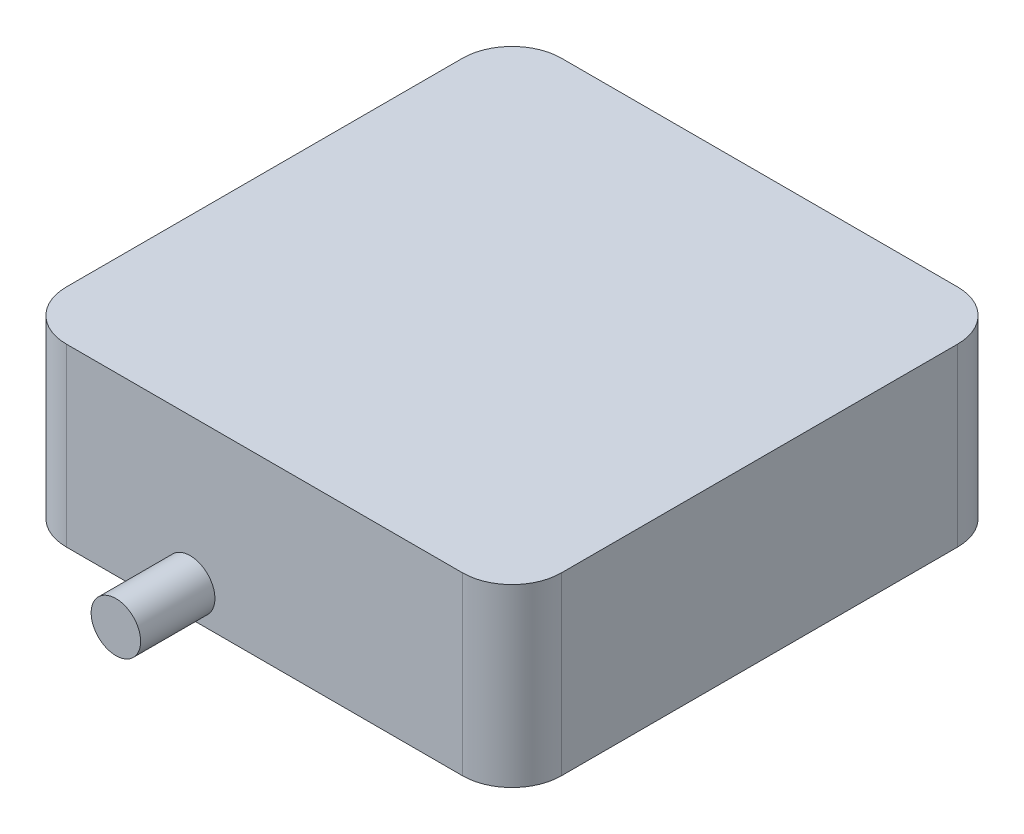
ISO-10303-21;
HEADER;
FILE_DESCRIPTION(('STEP AP214'),'2;1');
FILE_NAME('part.step','',(''),(''),'','','');
FILE_SCHEMA(('AUTOMOTIVE_DESIGN { 1 0 10303 214 1 1 1 1 }'));
ENDSEC;
DATA;
#1=APPLICATION_CONTEXT('core data for automotive mechanical design processes');
#2=APPLICATION_PROTOCOL_DEFINITION('international standard','automotive_design',2000,#1);
#3=PRODUCT_CONTEXT('',#1,'mechanical');
#4=PRODUCT('Part','Part','',(#3));
#5=PRODUCT_RELATED_PRODUCT_CATEGORY('part','',(#4));
#6=PRODUCT_DEFINITION_FORMATION('','',#4);
#7=PRODUCT_DEFINITION_CONTEXT('part definition',#1,'design');
#8=PRODUCT_DEFINITION('design','',#6,#7);
#9=PRODUCT_DEFINITION_SHAPE('','',#8);
#10=(LENGTH_UNIT() NAMED_UNIT(*) SI_UNIT(.MILLI.,.METRE.));
#11=(NAMED_UNIT(*) PLANE_ANGLE_UNIT() SI_UNIT($,.RADIAN.));
#12=(NAMED_UNIT(*) SI_UNIT($,.STERADIAN.) SOLID_ANGLE_UNIT());
#13=UNCERTAINTY_MEASURE_WITH_UNIT(LENGTH_MEASURE(1.E-05),#10,'distance_accuracy_value','');
#14=(GEOMETRIC_REPRESENTATION_CONTEXT(3) GLOBAL_UNCERTAINTY_ASSIGNED_CONTEXT((#13)) GLOBAL_UNIT_ASSIGNED_CONTEXT((#10,
#11,#12)) REPRESENTATION_CONTEXT('',''));
#15=CARTESIAN_POINT('',(0.,0.,0.));
#16=DIRECTION('',(0.,0.,1.));
#17=DIRECTION('',(1.,0.,0.));
#18=AXIS2_PLACEMENT_3D('',#15,#16,#17);
#19=CARTESIAN_POINT('',(100.,71.,100.));
#20=DIRECTION('',(-1.,0.,0.));
#21=DIRECTION('',(0.,0.,1.));
#22=AXIS2_PLACEMENT_3D('',#19,#20,#21);
#23=PLANE('',#22);
#24=DIRECTION('',(0.,0.,-1.));
#25=VECTOR('',#24,1.);
#26=CARTESIAN_POINT('',(100.,0.,100.));
#27=LINE('',#26,#25);
#28=CARTESIAN_POINT('',(100.,0.,80.));
#29=VERTEX_POINT('',#28);
#30=CARTESIAN_POINT('',(100.,0.,-80.));
#31=VERTEX_POINT('',#30);
#32=EDGE_CURVE('E141',#29,#31,#27,.T.);
#33=ORIENTED_EDGE('',*,*,#32,.T.);
#34=DIRECTION('',(0.,-1.,0.));
#35=VECTOR('',#34,1.);
#36=CARTESIAN_POINT('',(100.,71.,-80.));
#37=LINE('',#36,#35);
#38=CARTESIAN_POINT('',(100.,71.,-80.));
#39=VERTEX_POINT('',#38);
#40=EDGE_CURVE('E164',#31,#39,#37,.F.);
#41=ORIENTED_EDGE('',*,*,#40,.T.);
#42=DIRECTION('',(0.,0.,-1.));
#43=VECTOR('',#42,1.);
#44=CARTESIAN_POINT('',(100.,71.,100.));
#45=LINE('',#44,#43);
#46=CARTESIAN_POINT('',(100.,71.,80.));
#47=VERTEX_POINT('',#46);
#48=EDGE_CURVE('E139',#47,#39,#45,.T.);
#49=ORIENTED_EDGE('',*,*,#48,.F.);
#50=DIRECTION('',(0.,-1.,0.));
#51=VECTOR('',#50,1.);
#52=CARTESIAN_POINT('',(100.,71.,80.));
#53=LINE('',#52,#51);
#54=EDGE_CURVE('E161',#47,#29,#53,.T.);
#55=ORIENTED_EDGE('',*,*,#54,.T.);
#56=EDGE_LOOP('',(#33,#41,#49,#55));
#57=FACE_BOUND('',#56,.T.);
#58=ADVANCED_FACE('F45',(#57),#23,.F.);
#59=CARTESIAN_POINT('',(-100.,71.,-100.));
#60=DIRECTION('',(0.,0.,1.));
#61=DIRECTION('',(1.,0.,0.));
#62=AXIS2_PLACEMENT_3D('',#59,#60,#61);
#63=PLANE('',#62);
#64=DIRECTION('',(-1.,0.,0.));
#65=VECTOR('',#64,1.);
#66=CARTESIAN_POINT('',(-100.,0.,-100.));
#67=LINE('',#66,#65);
#68=CARTESIAN_POINT('',(80.,0.,-100.));
#69=VERTEX_POINT('',#68);
#70=CARTESIAN_POINT('',(-80.,0.,-100.));
#71=VERTEX_POINT('',#70);
#72=EDGE_CURVE('E137',#69,#71,#67,.T.);
#73=ORIENTED_EDGE('',*,*,#72,.T.);
#74=DIRECTION('',(0.,-1.,0.));
#75=VECTOR('',#74,1.);
#76=CARTESIAN_POINT('',(-80.,71.,-100.));
#77=LINE('',#76,#75);
#78=CARTESIAN_POINT('',(-80.,71.,-100.));
#79=VERTEX_POINT('',#78);
#80=EDGE_CURVE('E116',#71,#79,#77,.F.);
#81=ORIENTED_EDGE('',*,*,#80,.T.);
#82=DIRECTION('',(-1.,0.,0.));
#83=VECTOR('',#82,1.);
#84=CARTESIAN_POINT('',(-100.,71.,-100.));
#85=LINE('',#84,#83);
#86=CARTESIAN_POINT('',(80.,71.,-100.));
#87=VERTEX_POINT('',#86);
#88=EDGE_CURVE('E182',#87,#79,#85,.T.);
#89=ORIENTED_EDGE('',*,*,#88,.F.);
#90=DIRECTION('',(0.,-1.,0.));
#91=VECTOR('',#90,1.);
#92=CARTESIAN_POINT('',(80.,71.,-100.));
#93=LINE('',#92,#91);
#94=EDGE_CURVE('E121',#87,#69,#93,.T.);
#95=ORIENTED_EDGE('',*,*,#94,.T.);
#96=EDGE_LOOP('',(#73,#81,#89,#95));
#97=FACE_BOUND('',#96,.T.);
#98=ADVANCED_FACE('F210',(#97),#63,.F.);
#99=CARTESIAN_POINT('',(-100.,71.,100.));
#100=DIRECTION('',(1.,0.,0.));
#101=DIRECTION('',(0.,0.,-1.));
#102=AXIS2_PLACEMENT_3D('',#99,#100,#101);
#103=PLANE('',#102);
#104=DIRECTION('',(0.,0.,1.));
#105=VECTOR('',#104,1.);
#106=CARTESIAN_POINT('',(-100.,71.,100.));
#107=LINE('',#106,#105);
#108=CARTESIAN_POINT('',(-100.,71.,-80.));
#109=VERTEX_POINT('',#108);
#110=CARTESIAN_POINT('',(-100.,71.,80.));
#111=VERTEX_POINT('',#110);
#112=EDGE_CURVE('E130',#109,#111,#107,.T.);
#113=ORIENTED_EDGE('',*,*,#112,.F.);
#114=DIRECTION('',(0.,-1.,0.));
#115=VECTOR('',#114,1.);
#116=CARTESIAN_POINT('',(-100.,71.,-80.));
#117=LINE('',#116,#115);
#118=CARTESIAN_POINT('',(-100.,0.,-80.));
#119=VERTEX_POINT('',#118);
#120=EDGE_CURVE('E115',#109,#119,#117,.T.);
#121=ORIENTED_EDGE('',*,*,#120,.T.);
#122=DIRECTION('',(0.,0.,1.));
#123=VECTOR('',#122,1.);
#124=CARTESIAN_POINT('',(-100.,0.,100.));
#125=LINE('',#124,#123);
#126=CARTESIAN_POINT('',(-100.,0.,80.));
#127=VERTEX_POINT('',#126);
#128=EDGE_CURVE('E128',#119,#127,#125,.T.);
#129=ORIENTED_EDGE('',*,*,#128,.T.);
#130=DIRECTION('',(0.,-1.,0.));
#131=VECTOR('',#130,1.);
#132=CARTESIAN_POINT('',(-100.,71.,80.));
#133=LINE('',#132,#131);
#134=EDGE_CURVE('E132',#127,#111,#133,.F.);
#135=ORIENTED_EDGE('',*,*,#134,.T.);
#136=EDGE_LOOP('',(#113,#121,#129,#135));
#137=FACE_BOUND('',#136,.T.);
#138=ADVANCED_FACE('F127',(#137),#103,.F.);
#139=CARTESIAN_POINT('',(-100.,71.,100.));
#140=DIRECTION('',(0.,0.,-1.));
#141=DIRECTION('',(-1.,0.,0.));
#142=AXIS2_PLACEMENT_3D('',#139,#140,#141);
#143=PLANE('',#142);
#144=CARTESIAN_POINT('',(-30.,12.,100.));
#145=DIRECTION('',(0.,0.,-1.));
#146=DIRECTION('',(-1.,0.,0.));
#147=AXIS2_PLACEMENT_3D('',#144,#145,#146);
#148=CIRCLE('',#147,10.);
#149=CARTESIAN_POINT('',(-40.,12.,100.));
#150=VERTEX_POINT('',#149);
#151=EDGE_CURVE('E11',#150,#150,#148,.F.);
#152=ORIENTED_EDGE('',*,*,#151,.F.);
#153=EDGE_LOOP('',(#152));
#154=FACE_BOUND('',#153,.T.);
#155=DIRECTION('',(1.,0.,0.));
#156=VECTOR('',#155,1.);
#157=CARTESIAN_POINT('',(-100.,0.,100.));
#158=LINE('',#157,#156);
#159=CARTESIAN_POINT('',(-80.,0.,100.));
#160=VERTEX_POINT('',#159);
#161=CARTESIAN_POINT('',(80.,0.,100.));
#162=VERTEX_POINT('',#161);
#163=EDGE_CURVE('E136',#160,#162,#158,.T.);
#164=ORIENTED_EDGE('',*,*,#163,.T.);
#165=DIRECTION('',(0.,-1.,0.));
#166=VECTOR('',#165,1.);
#167=CARTESIAN_POINT('',(80.,71.,100.));
#168=LINE('',#167,#166);
#169=CARTESIAN_POINT('',(80.,71.,100.));
#170=VERTEX_POINT('',#169);
#171=EDGE_CURVE('E53',#162,#170,#168,.F.);
#172=ORIENTED_EDGE('',*,*,#171,.T.);
#173=DIRECTION('',(1.,0.,0.));
#174=VECTOR('',#173,1.);
#175=CARTESIAN_POINT('',(-100.,71.,100.));
#176=LINE('',#175,#174);
#177=CARTESIAN_POINT('',(-80.,71.,100.));
#178=VERTEX_POINT('',#177);
#179=EDGE_CURVE('E145',#178,#170,#176,.T.);
#180=ORIENTED_EDGE('',*,*,#179,.F.);
#181=DIRECTION('',(0.,-1.,0.));
#182=VECTOR('',#181,1.);
#183=CARTESIAN_POINT('',(-80.,71.,100.));
#184=LINE('',#183,#182);
#185=EDGE_CURVE('E166',#178,#160,#184,.T.);
#186=ORIENTED_EDGE('',*,*,#185,.T.);
#187=EDGE_LOOP('',(#164,#172,#180,#186));
#188=FACE_BOUND('',#187,.T.);
#189=ADVANCED_FACE('F169',(#154,#188),#143,.F.);
#190=CARTESIAN_POINT('',(0.,71.,0.));
#191=DIRECTION('',(0.,-1.,0.));
#192=DIRECTION('',(0.,0.,-1.));
#193=AXIS2_PLACEMENT_3D('',#190,#191,#192);
#194=PLANE('',#193);
#195=ORIENTED_EDGE('',*,*,#88,.T.);
#196=CARTESIAN_POINT('',(-80.,71.,-80.));
#197=DIRECTION('',(0.,-1.,0.));
#198=DIRECTION('',(0.,0.,-1.));
#199=AXIS2_PLACEMENT_3D('',#196,#197,#198);
#200=CIRCLE('',#199,20.);
#201=EDGE_CURVE('E159',#79,#109,#200,.F.);
#202=ORIENTED_EDGE('',*,*,#201,.T.);
#203=ORIENTED_EDGE('',*,*,#112,.T.);
#204=CARTESIAN_POINT('',(-80.,71.,80.));
#205=DIRECTION('',(0.,-1.,0.));
#206=DIRECTION('',(0.,0.,-1.));
#207=AXIS2_PLACEMENT_3D('',#204,#205,#206);
#208=CIRCLE('',#207,20.);
#209=EDGE_CURVE('E66',#111,#178,#208,.F.);
#210=ORIENTED_EDGE('',*,*,#209,.T.);
#211=ORIENTED_EDGE('',*,*,#179,.T.);
#212=CARTESIAN_POINT('',(80.,71.,80.));
#213=DIRECTION('',(0.,-1.,0.));
#214=DIRECTION('',(0.,0.,-1.));
#215=AXIS2_PLACEMENT_3D('',#212,#213,#214);
#216=CIRCLE('',#215,20.);
#217=EDGE_CURVE('E155',#170,#47,#216,.F.);
#218=ORIENTED_EDGE('',*,*,#217,.T.);
#219=ORIENTED_EDGE('',*,*,#48,.T.);
#220=CARTESIAN_POINT('',(80.,71.,-80.));
#221=DIRECTION('',(0.,-1.,0.));
#222=DIRECTION('',(0.,0.,-1.));
#223=AXIS2_PLACEMENT_3D('',#220,#221,#222);
#224=CIRCLE('',#223,20.);
#225=EDGE_CURVE('E157',#39,#87,#224,.F.);
#226=ORIENTED_EDGE('',*,*,#225,.T.);
#227=EDGE_LOOP('',(#195,#202,#203,#210,#211,#218,#219,#226));
#228=FACE_BOUND('',#227,.T.);
#229=ADVANCED_FACE('F202',(#228),#194,.F.);
#230=CARTESIAN_POINT('',(0.,0.,0.));
#231=DIRECTION('',(0.,-1.,0.));
#232=DIRECTION('',(0.,0.,-1.));
#233=AXIS2_PLACEMENT_3D('',#230,#231,#232);
#234=PLANE('',#233);
#235=ORIENTED_EDGE('',*,*,#128,.F.);
#236=CARTESIAN_POINT('',(-80.,0.,-80.));
#237=DIRECTION('',(0.,-1.,0.));
#238=DIRECTION('',(0.,0.,-1.));
#239=AXIS2_PLACEMENT_3D('',#236,#237,#238);
#240=CIRCLE('',#239,20.);
#241=EDGE_CURVE('E111',#119,#71,#240,.T.);
#242=ORIENTED_EDGE('',*,*,#241,.T.);
#243=ORIENTED_EDGE('',*,*,#72,.F.);
#244=CARTESIAN_POINT('',(80.,0.,-80.));
#245=DIRECTION('',(0.,-1.,0.));
#246=DIRECTION('',(0.,0.,-1.));
#247=AXIS2_PLACEMENT_3D('',#244,#245,#246);
#248=CIRCLE('',#247,20.);
#249=EDGE_CURVE('E122',#69,#31,#248,.T.);
#250=ORIENTED_EDGE('',*,*,#249,.T.);
#251=ORIENTED_EDGE('',*,*,#32,.F.);
#252=CARTESIAN_POINT('',(80.,0.,80.));
#253=DIRECTION('',(0.,-1.,0.));
#254=DIRECTION('',(0.,0.,-1.));
#255=AXIS2_PLACEMENT_3D('',#252,#253,#254);
#256=CIRCLE('',#255,20.);
#257=EDGE_CURVE('E148',#29,#162,#256,.T.);
#258=ORIENTED_EDGE('',*,*,#257,.T.);
#259=ORIENTED_EDGE('',*,*,#163,.F.);
#260=CARTESIAN_POINT('',(-80.,0.,80.));
#261=DIRECTION('',(0.,-1.,0.));
#262=DIRECTION('',(0.,0.,-1.));
#263=AXIS2_PLACEMENT_3D('',#260,#261,#262);
#264=CIRCLE('',#263,20.);
#265=EDGE_CURVE('E131',#160,#127,#264,.T.);
#266=ORIENTED_EDGE('',*,*,#265,.T.);
#267=EDGE_LOOP('',(#235,#242,#243,#250,#251,#258,#259,#266));
#268=FACE_BOUND('',#267,.T.);
#269=ADVANCED_FACE('F134',(#268),#234,.T.);
#270=CARTESIAN_POINT('',(-80.,71.,-80.));
#271=DIRECTION('',(0.,-1.,0.));
#272=DIRECTION('',(0.,0.,-1.));
#273=AXIS2_PLACEMENT_3D('',#270,#271,#272);
#274=CYLINDRICAL_SURFACE('',#273,20.);
#275=ORIENTED_EDGE('',*,*,#201,.F.);
#276=ORIENTED_EDGE('',*,*,#80,.F.);
#277=ORIENTED_EDGE('',*,*,#241,.F.);
#278=ORIENTED_EDGE('',*,*,#120,.F.);
#279=EDGE_LOOP('',(#275,#276,#277,#278));
#280=FACE_BOUND('',#279,.T.);
#281=ADVANCED_FACE('F114',(#280),#274,.T.);
#282=CARTESIAN_POINT('',(80.,71.,-80.));
#283=DIRECTION('',(0.,-1.,0.));
#284=DIRECTION('',(0.,0.,-1.));
#285=AXIS2_PLACEMENT_3D('',#282,#283,#284);
#286=CYLINDRICAL_SURFACE('',#285,20.);
#287=ORIENTED_EDGE('',*,*,#225,.F.);
#288=ORIENTED_EDGE('',*,*,#40,.F.);
#289=ORIENTED_EDGE('',*,*,#249,.F.);
#290=ORIENTED_EDGE('',*,*,#94,.F.);
#291=EDGE_LOOP('',(#287,#288,#289,#290));
#292=FACE_BOUND('',#291,.T.);
#293=ADVANCED_FACE('F223',(#292),#286,.T.);
#294=CARTESIAN_POINT('',(80.,71.,80.));
#295=DIRECTION('',(0.,-1.,0.));
#296=DIRECTION('',(0.,0.,-1.));
#297=AXIS2_PLACEMENT_3D('',#294,#295,#296);
#298=CYLINDRICAL_SURFACE('',#297,20.);
#299=ORIENTED_EDGE('',*,*,#217,.F.);
#300=ORIENTED_EDGE('',*,*,#171,.F.);
#301=ORIENTED_EDGE('',*,*,#257,.F.);
#302=ORIENTED_EDGE('',*,*,#54,.F.);
#303=EDGE_LOOP('',(#299,#300,#301,#302));
#304=FACE_BOUND('',#303,.T.);
#305=ADVANCED_FACE('F176',(#304),#298,.T.);
#306=CARTESIAN_POINT('',(-80.,71.,80.));
#307=DIRECTION('',(0.,-1.,0.));
#308=DIRECTION('',(0.,0.,-1.));
#309=AXIS2_PLACEMENT_3D('',#306,#307,#308);
#310=CYLINDRICAL_SURFACE('',#309,20.);
#311=ORIENTED_EDGE('',*,*,#209,.F.);
#312=ORIENTED_EDGE('',*,*,#134,.F.);
#313=ORIENTED_EDGE('',*,*,#265,.F.);
#314=ORIENTED_EDGE('',*,*,#185,.F.);
#315=EDGE_LOOP('',(#311,#312,#313,#314));
#316=FACE_BOUND('',#315,.T.);
#317=ADVANCED_FACE('F47',(#316),#310,.T.);
#318=CARTESIAN_POINT('',(-30.,12.,130.));
#319=DIRECTION('',(0.,0.,-1.));
#320=DIRECTION('',(-1.,0.,0.));
#321=AXIS2_PLACEMENT_3D('',#318,#319,#320);
#322=CYLINDRICAL_SURFACE('',#321,10.);
#323=CARTESIAN_POINT('',(-30.,12.,130.));
#324=DIRECTION('',(0.,0.,1.));
#325=DIRECTION('',(1.,0.,0.));
#326=AXIS2_PLACEMENT_3D('',#323,#324,#325);
#327=CIRCLE('',#326,10.);
#328=CARTESIAN_POINT('',(-20.,12.,130.));
#329=VERTEX_POINT('',#328);
#330=EDGE_CURVE('E187',#329,#329,#327,.T.);
#331=ORIENTED_EDGE('',*,*,#330,.F.);
#332=EDGE_LOOP('',(#331));
#333=FACE_BOUND('',#332,.T.);
#334=ORIENTED_EDGE('',*,*,#151,.T.);
#335=EDGE_LOOP('',(#334));
#336=FACE_BOUND('',#335,.T.);
#337=ADVANCED_FACE('F195',(#333,#336),#322,.T.);
#338=CARTESIAN_POINT('',(-30.,12.,130.));
#339=DIRECTION('',(0.,0.,1.));
#340=DIRECTION('',(1.,0.,0.));
#341=AXIS2_PLACEMENT_3D('',#338,#339,#340);
#342=PLANE('',#341);
#343=ORIENTED_EDGE('',*,*,#330,.T.);
#344=EDGE_LOOP('',(#343));
#345=FACE_BOUND('',#344,.T.);
#346=ADVANCED_FACE('F193',(#345),#342,.T.);
#347=CLOSED_SHELL('',(#58,#98,#138,#189,#229,#269,#281,#293,#305,#317,#337,#346));
#348=MANIFOLD_SOLID_BREP('B2',#347);
#349=ADVANCED_BREP_SHAPE_REPRESENTATION('',(#18,#348),#14);
#350=SHAPE_DEFINITION_REPRESENTATION(#9,#349);
ENDSEC;
END-ISO-10303-21;
